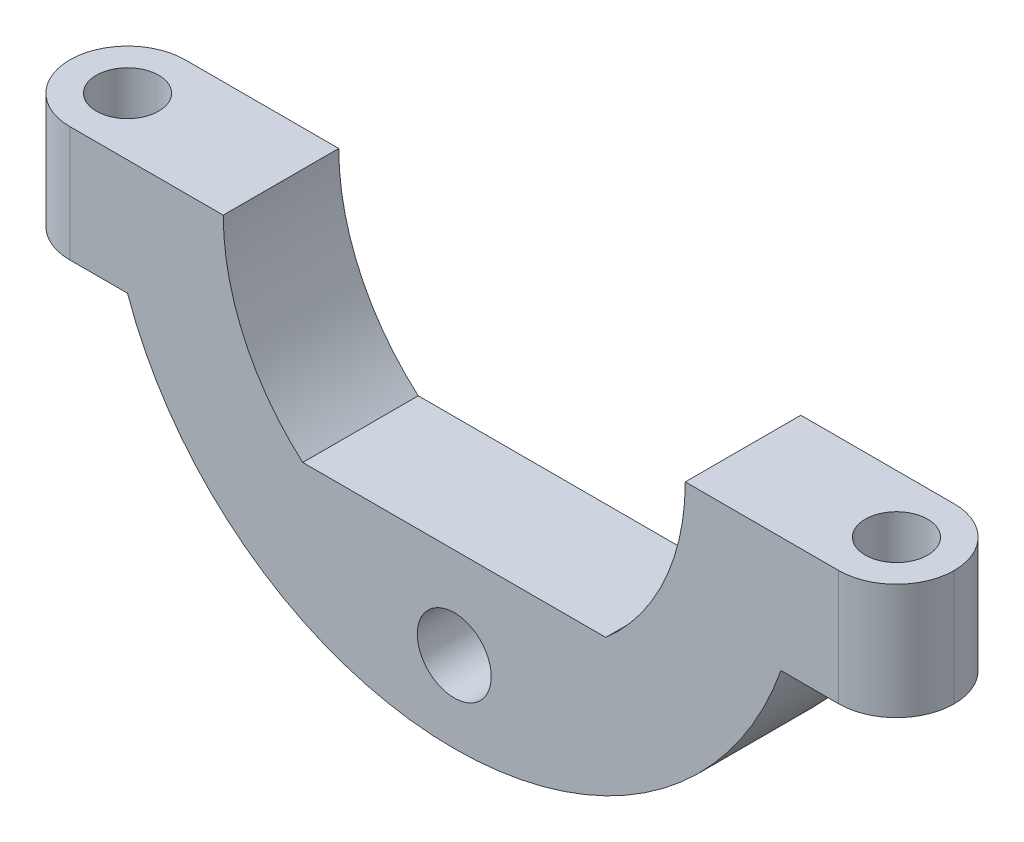
ISO-10303-21;
HEADER;
FILE_DESCRIPTION(('STEP AP214'),'2;1');
FILE_NAME('part.step','',(''),(''),'','','');
FILE_SCHEMA(('AUTOMOTIVE_DESIGN { 1 0 10303 214 1 1 1 1 }'));
ENDSEC;
DATA;
#1=APPLICATION_CONTEXT('core data for automotive mechanical design processes');
#2=APPLICATION_PROTOCOL_DEFINITION('international standard','automotive_design',2000,#1);
#3=PRODUCT_CONTEXT('',#1,'mechanical');
#4=PRODUCT('Part','Part','',(#3));
#5=PRODUCT_RELATED_PRODUCT_CATEGORY('part','',(#4));
#6=PRODUCT_DEFINITION_FORMATION('','',#4);
#7=PRODUCT_DEFINITION_CONTEXT('part definition',#1,'design');
#8=PRODUCT_DEFINITION('design','',#6,#7);
#9=PRODUCT_DEFINITION_SHAPE('','',#8);
#10=(LENGTH_UNIT() NAMED_UNIT(*) SI_UNIT(.MILLI.,.METRE.));
#11=(NAMED_UNIT(*) PLANE_ANGLE_UNIT() SI_UNIT($,.RADIAN.));
#12=(NAMED_UNIT(*) SI_UNIT($,.STERADIAN.) SOLID_ANGLE_UNIT());
#13=UNCERTAINTY_MEASURE_WITH_UNIT(LENGTH_MEASURE(1.E-05),#10,'distance_accuracy_value','');
#14=(GEOMETRIC_REPRESENTATION_CONTEXT(3) GLOBAL_UNCERTAINTY_ASSIGNED_CONTEXT((#13)) GLOBAL_UNIT_ASSIGNED_CONTEXT((#10,
#11,#12)) REPRESENTATION_CONTEXT('',''));
#15=CARTESIAN_POINT('',(0.,0.,0.));
#16=DIRECTION('',(0.,0.,1.));
#17=DIRECTION('',(1.,0.,0.));
#18=AXIS2_PLACEMENT_3D('',#15,#16,#17);
#19=CARTESIAN_POINT('',(0.,0.,0.));
#20=DIRECTION('',(0.,1.,0.));
#21=DIRECTION('',(0.,0.,1.));
#22=AXIS2_PLACEMENT_3D('',#19,#20,#21);
#23=PLANE('',#22);
#24=CARTESIAN_POINT('',(16.642135623731,0.,2.5));
#25=DIRECTION('',(0.,1.,0.));
#26=DIRECTION('',(0.,0.,1.));
#27=AXIS2_PLACEMENT_3D('',#24,#25,#26);
#28=CIRCLE('',#27,1.35000000000001);
#29=CARTESIAN_POINT('',(16.642135623731,0.,3.85000000000001));
#30=VERTEX_POINT('',#29);
#31=EDGE_CURVE('E162',#30,#30,#28,.F.);
#32=ORIENTED_EDGE('',*,*,#31,.T.);
#33=EDGE_LOOP('',(#32));
#34=FACE_BOUND('',#33,.T.);
#35=DIRECTION('',(0.,0.,-1.));
#36=VECTOR('',#35,1.);
#37=CARTESIAN_POINT('',(10.,0.,5.));
#38=LINE('',#37,#36);
#39=CARTESIAN_POINT('',(10.,0.,5.));
#40=VERTEX_POINT('',#39);
#41=CARTESIAN_POINT('',(10.,0.,0.));
#42=VERTEX_POINT('',#41);
#43=EDGE_CURVE('E150',#40,#42,#38,.T.);
#44=ORIENTED_EDGE('',*,*,#43,.F.);
#45=DIRECTION('',(-1.,0.,0.));
#46=VECTOR('',#45,1.);
#47=CARTESIAN_POINT('',(0.,0.,5.));
#48=LINE('',#47,#46);
#49=CARTESIAN_POINT('',(16.642135623731,0.,5.));
#50=VERTEX_POINT('',#49);
#51=EDGE_CURVE('E216',#50,#40,#48,.T.);
#52=ORIENTED_EDGE('',*,*,#51,.F.);
#53=CARTESIAN_POINT('',(16.642135623731,0.,2.5));
#54=DIRECTION('',(0.,1.,0.));
#55=DIRECTION('',(0.,0.,1.));
#56=AXIS2_PLACEMENT_3D('',#53,#54,#55);
#57=CIRCLE('',#56,2.5);
#58=CARTESIAN_POINT('',(19.142135623731,0.,2.5));
#59=VERTEX_POINT('',#58);
#60=EDGE_CURVE('E209',#59,#50,#57,.F.);
#61=ORIENTED_EDGE('',*,*,#60,.F.);
#62=CARTESIAN_POINT('',(16.642135623731,0.,2.5));
#63=DIRECTION('',(0.,1.,0.));
#64=DIRECTION('',(0.,0.,1.));
#65=AXIS2_PLACEMENT_3D('',#62,#63,#64);
#66=CIRCLE('',#65,2.5);
#67=CARTESIAN_POINT('',(16.642135623731,0.,0.));
#68=VERTEX_POINT('',#67);
#69=EDGE_CURVE('E158',#68,#59,#66,.F.);
#70=ORIENTED_EDGE('',*,*,#69,.F.);
#71=DIRECTION('',(-1.,0.,0.));
#72=VECTOR('',#71,1.);
#73=CARTESIAN_POINT('',(0.,0.,0.));
#74=LINE('',#73,#72);
#75=EDGE_CURVE('E143',#68,#42,#74,.T.);
#76=ORIENTED_EDGE('',*,*,#75,.T.);
#77=EDGE_LOOP('',(#44,#52,#61,#70,#76));
#78=FACE_BOUND('',#77,.T.);
#79=ADVANCED_FACE('F40',(#34,#78),#23,.T.);
#80=DIRECTION('',(0.,0.,-1.));
#81=VECTOR('',#80,1.);
#82=CARTESIAN_POINT('',(-10.,0.,5.));
#83=LINE('',#82,#81);
#84=CARTESIAN_POINT('',(-10.,0.,0.));
#85=VERTEX_POINT('',#84);
#86=CARTESIAN_POINT('',(-10.,0.,5.));
#87=VERTEX_POINT('',#86);
#88=EDGE_CURVE('E155',#85,#87,#83,.F.);
#89=ORIENTED_EDGE('',*,*,#88,.F.);
#90=CARTESIAN_POINT('',(-16.642135623731,0.,0.));
#91=VERTEX_POINT('',#90);
#92=EDGE_CURVE('E159',#85,#91,#74,.T.);
#93=ORIENTED_EDGE('',*,*,#92,.T.);
#94=CARTESIAN_POINT('',(-16.642135623731,0.,2.5));
#95=DIRECTION('',(0.,1.,0.));
#96=DIRECTION('',(0.,0.,1.));
#97=AXIS2_PLACEMENT_3D('',#94,#95,#96);
#98=CIRCLE('',#97,2.5);
#99=CARTESIAN_POINT('',(-19.142135623731,0.,2.5));
#100=VERTEX_POINT('',#99);
#101=EDGE_CURVE('E207',#100,#91,#98,.F.);
#102=ORIENTED_EDGE('',*,*,#101,.F.);
#103=CARTESIAN_POINT('',(-16.642135623731,0.,2.5));
#104=DIRECTION('',(0.,1.,0.));
#105=DIRECTION('',(0.,0.,1.));
#106=AXIS2_PLACEMENT_3D('',#103,#104,#105);
#107=CIRCLE('',#106,2.5);
#108=CARTESIAN_POINT('',(-16.642135623731,0.,5.));
#109=VERTEX_POINT('',#108);
#110=EDGE_CURVE('E204',#109,#100,#107,.F.);
#111=ORIENTED_EDGE('',*,*,#110,.F.);
#112=EDGE_CURVE('E215',#87,#109,#48,.T.);
#113=ORIENTED_EDGE('',*,*,#112,.F.);
#114=EDGE_LOOP('',(#89,#93,#102,#111,#113));
#115=FACE_BOUND('',#114,.T.);
#116=CARTESIAN_POINT('',(-16.642135623731,0.,2.5));
#117=DIRECTION('',(0.,1.,0.));
#118=DIRECTION('',(0.,0.,1.));
#119=AXIS2_PLACEMENT_3D('',#116,#117,#118);
#120=CIRCLE('',#119,1.35000000000001);
#121=CARTESIAN_POINT('',(-16.642135623731,0.,3.85000000000001));
#122=VERTEX_POINT('',#121);
#123=EDGE_CURVE('E212',#122,#122,#120,.T.);
#124=ORIENTED_EDGE('',*,*,#123,.F.);
#125=EDGE_LOOP('',(#124));
#126=FACE_BOUND('',#125,.T.);
#127=ADVANCED_FACE('F246',(#115,#126),#23,.T.);
#128=CARTESIAN_POINT('',(0.,0.,5.));
#129=DIRECTION('',(0.,0.,-1.));
#130=DIRECTION('',(-1.,0.,0.));
#131=AXIS2_PLACEMENT_3D('',#128,#129,#130);
#132=CYLINDRICAL_SURFACE('',#131,10.);
#133=CARTESIAN_POINT('',(0.,0.,5.));
#134=DIRECTION('',(0.,0.,1.));
#135=DIRECTION('',(1.,0.,0.));
#136=AXIS2_PLACEMENT_3D('',#133,#134,#135);
#137=CIRCLE('',#136,10.);
#138=CARTESIAN_POINT('',(6.55724789831832,-7.55,5.));
#139=VERTEX_POINT('',#138);
#140=EDGE_CURVE('E152',#139,#40,#137,.T.);
#141=ORIENTED_EDGE('',*,*,#140,.T.);
#142=ORIENTED_EDGE('',*,*,#43,.T.);
#143=CARTESIAN_POINT('',(0.,0.,0.));
#144=DIRECTION('',(0.,0.,1.));
#145=DIRECTION('',(1.,0.,0.));
#146=AXIS2_PLACEMENT_3D('',#143,#144,#145);
#147=CIRCLE('',#146,10.);
#148=CARTESIAN_POINT('',(6.55724789831832,-7.55,0.));
#149=VERTEX_POINT('',#148);
#150=EDGE_CURVE('E139',#149,#42,#147,.T.);
#151=ORIENTED_EDGE('',*,*,#150,.F.);
#152=DIRECTION('',(0.,0.,-1.));
#153=VECTOR('',#152,1.);
#154=CARTESIAN_POINT('',(6.55724789831832,-7.55,5.));
#155=LINE('',#154,#153);
#156=EDGE_CURVE('E57',#139,#149,#155,.T.);
#157=ORIENTED_EDGE('',*,*,#156,.F.);
#158=EDGE_LOOP('',(#141,#142,#151,#157));
#159=FACE_BOUND('',#158,.T.);
#160=ADVANCED_FACE('F151',(#159),#132,.F.);
#161=CARTESIAN_POINT('',(0.,-7.55,5.));
#162=DIRECTION('',(0.,1.,0.));
#163=DIRECTION('',(0.,0.,1.));
#164=AXIS2_PLACEMENT_3D('',#161,#162,#163);
#165=PLANE('',#164);
#166=DIRECTION('',(1.,0.,0.));
#167=VECTOR('',#166,1.);
#168=CARTESIAN_POINT('',(0.,-7.55,0.));
#169=LINE('',#168,#167);
#170=CARTESIAN_POINT('',(-6.55724789831832,-7.55,0.));
#171=VERTEX_POINT('',#170);
#172=EDGE_CURVE('E145',#171,#149,#169,.T.);
#173=ORIENTED_EDGE('',*,*,#172,.F.);
#174=DIRECTION('',(0.,0.,-1.));
#175=VECTOR('',#174,1.);
#176=CARTESIAN_POINT('',(-6.55724789831832,-7.55,5.));
#177=LINE('',#176,#175);
#178=CARTESIAN_POINT('',(-6.55724789831832,-7.55,5.));
#179=VERTEX_POINT('',#178);
#180=EDGE_CURVE('E302',#179,#171,#177,.T.);
#181=ORIENTED_EDGE('',*,*,#180,.F.);
#182=DIRECTION('',(1.,0.,0.));
#183=VECTOR('',#182,1.);
#184=CARTESIAN_POINT('',(0.,-7.55,5.));
#185=LINE('',#184,#183);
#186=EDGE_CURVE('E185',#179,#139,#185,.T.);
#187=ORIENTED_EDGE('',*,*,#186,.T.);
#188=ORIENTED_EDGE('',*,*,#156,.T.);
#189=EDGE_LOOP('',(#173,#181,#187,#188));
#190=FACE_BOUND('',#189,.T.);
#191=ADVANCED_FACE('F253',(#190),#165,.T.);
#192=EDGE_CURVE('E148',#85,#171,#147,.T.);
#193=ORIENTED_EDGE('',*,*,#192,.F.);
#194=ORIENTED_EDGE('',*,*,#88,.T.);
#195=EDGE_CURVE('E76',#87,#179,#137,.T.);
#196=ORIENTED_EDGE('',*,*,#195,.T.);
#197=ORIENTED_EDGE('',*,*,#180,.T.);
#198=EDGE_LOOP('',(#193,#194,#196,#197));
#199=FACE_BOUND('',#198,.T.);
#200=ADVANCED_FACE('F218',(#199),#132,.F.);
#201=CARTESIAN_POINT('',(0.,0.,5.));
#202=DIRECTION('',(0.,0.,-1.));
#203=DIRECTION('',(-1.,0.,0.));
#204=AXIS2_PLACEMENT_3D('',#201,#202,#203);
#205=CYLINDRICAL_SURFACE('',#204,15.);
#206=CARTESIAN_POINT('',(0.,0.,0.));
#207=DIRECTION('',(0.,0.,1.));
#208=DIRECTION('',(1.,0.,0.));
#209=AXIS2_PLACEMENT_3D('',#206,#207,#208);
#210=CIRCLE('',#209,15.);
#211=CARTESIAN_POINT('',(-14.142135623731,-5.,0.));
#212=VERTEX_POINT('',#211);
#213=CARTESIAN_POINT('',(14.1421356237309,-5.,0.));
#214=VERTEX_POINT('',#213);
#215=EDGE_CURVE('E186',#212,#214,#210,.T.);
#216=ORIENTED_EDGE('',*,*,#215,.T.);
#217=DIRECTION('',(0.,0.,-1.));
#218=VECTOR('',#217,1.);
#219=CARTESIAN_POINT('',(14.1421356237309,-5.,5.));
#220=LINE('',#219,#218);
#221=CARTESIAN_POINT('',(14.1421356237309,-5.,5.));
#222=VERTEX_POINT('',#221);
#223=EDGE_CURVE('E300',#222,#214,#220,.T.);
#224=ORIENTED_EDGE('',*,*,#223,.F.);
#225=CARTESIAN_POINT('',(0.,0.,5.));
#226=DIRECTION('',(0.,0.,1.));
#227=DIRECTION('',(1.,0.,0.));
#228=AXIS2_PLACEMENT_3D('',#225,#226,#227);
#229=CIRCLE('',#228,15.);
#230=CARTESIAN_POINT('',(-14.142135623731,-5.,5.));
#231=VERTEX_POINT('',#230);
#232=EDGE_CURVE('E179',#231,#222,#229,.T.);
#233=ORIENTED_EDGE('',*,*,#232,.F.);
#234=DIRECTION('',(0.,0.,-1.));
#235=VECTOR('',#234,1.);
#236=CARTESIAN_POINT('',(-14.142135623731,-5.,5.));
#237=LINE('',#236,#235);
#238=EDGE_CURVE('E87',#231,#212,#237,.T.);
#239=ORIENTED_EDGE('',*,*,#238,.T.);
#240=EDGE_LOOP('',(#216,#224,#233,#239));
#241=FACE_BOUND('',#240,.T.);
#242=ADVANCED_FACE('F260',(#241),#205,.T.);
#243=CARTESIAN_POINT('',(0.,-11.5,0.));
#244=DIRECTION('',(0.,0.,1.));
#245=DIRECTION('',(1.,0.,0.));
#246=AXIS2_PLACEMENT_3D('',#243,#244,#245);
#247=CYLINDRICAL_SURFACE('',#246,1.6);
#248=CARTESIAN_POINT('',(0.,-11.5,0.));
#249=DIRECTION('',(0.,0.,1.));
#250=DIRECTION('',(-1.,0.,0.));
#251=AXIS2_PLACEMENT_3D('',#248,#249,#250);
#252=CIRCLE('',#251,1.6);
#253=CARTESIAN_POINT('',(-1.6,-11.5,0.));
#254=VERTEX_POINT('',#253);
#255=EDGE_CURVE('E189',#254,#254,#252,.T.);
#256=ORIENTED_EDGE('',*,*,#255,.F.);
#257=EDGE_LOOP('',(#256));
#258=FACE_BOUND('',#257,.T.);
#259=CARTESIAN_POINT('',(0.,-11.5,5.));
#260=DIRECTION('',(0.,0.,1.));
#261=DIRECTION('',(-1.,0.,0.));
#262=AXIS2_PLACEMENT_3D('',#259,#260,#261);
#263=CIRCLE('',#262,1.6);
#264=CARTESIAN_POINT('',(-1.6,-11.5,5.));
#265=VERTEX_POINT('',#264);
#266=EDGE_CURVE('E194',#265,#265,#263,.T.);
#267=ORIENTED_EDGE('',*,*,#266,.T.);
#268=EDGE_LOOP('',(#267));
#269=FACE_BOUND('',#268,.T.);
#270=ADVANCED_FACE('F258',(#258,#269),#247,.F.);
#271=CARTESIAN_POINT('',(0.,-5.,5.));
#272=DIRECTION('',(0.,1.,0.));
#273=DIRECTION('',(0.,0.,1.));
#274=AXIS2_PLACEMENT_3D('',#271,#272,#273);
#275=PLANE('',#274);
#276=CARTESIAN_POINT('',(16.642135623731,-5.,2.5));
#277=DIRECTION('',(0.,-1.,0.));
#278=DIRECTION('',(1.,0.,0.));
#279=AXIS2_PLACEMENT_3D('',#276,#277,#278);
#280=CIRCLE('',#279,1.35000000000001);
#281=CARTESIAN_POINT('',(17.992135623731,-5.,2.5));
#282=VERTEX_POINT('',#281);
#283=EDGE_CURVE('E146',#282,#282,#280,.T.);
#284=ORIENTED_EDGE('',*,*,#283,.F.);
#285=EDGE_LOOP('',(#284));
#286=FACE_BOUND('',#285,.T.);
#287=CARTESIAN_POINT('',(16.642135623731,-5.,2.5));
#288=DIRECTION('',(0.,1.,0.));
#289=DIRECTION('',(0.,0.,1.));
#290=AXIS2_PLACEMENT_3D('',#287,#288,#289);
#291=CIRCLE('',#290,2.5);
#292=CARTESIAN_POINT('',(16.642135623731,-5.,0.));
#293=VERTEX_POINT('',#292);
#294=CARTESIAN_POINT('',(19.142135623731,-5.,2.5));
#295=VERTEX_POINT('',#294);
#296=EDGE_CURVE('E298',#293,#295,#291,.F.);
#297=ORIENTED_EDGE('',*,*,#296,.T.);
#298=CARTESIAN_POINT('',(16.642135623731,-5.,2.5));
#299=DIRECTION('',(0.,1.,0.));
#300=DIRECTION('',(0.,0.,1.));
#301=AXIS2_PLACEMENT_3D('',#298,#299,#300);
#302=CIRCLE('',#301,2.5);
#303=CARTESIAN_POINT('',(16.642135623731,-5.,5.));
#304=VERTEX_POINT('',#303);
#305=EDGE_CURVE('E178',#295,#304,#302,.F.);
#306=ORIENTED_EDGE('',*,*,#305,.T.);
#307=DIRECTION('',(1.,0.,0.));
#308=VECTOR('',#307,1.);
#309=CARTESIAN_POINT('',(0.,-5.,5.));
#310=LINE('',#309,#308);
#311=EDGE_CURVE('E182',#222,#304,#310,.T.);
#312=ORIENTED_EDGE('',*,*,#311,.F.);
#313=ORIENTED_EDGE('',*,*,#223,.T.);
#314=DIRECTION('',(1.,0.,0.));
#315=VECTOR('',#314,1.);
#316=CARTESIAN_POINT('',(0.,-5.,0.));
#317=LINE('',#316,#315);
#318=EDGE_CURVE('E187',#214,#293,#317,.T.);
#319=ORIENTED_EDGE('',*,*,#318,.T.);
#320=EDGE_LOOP('',(#297,#306,#312,#313,#319));
#321=FACE_BOUND('',#320,.T.);
#322=ADVANCED_FACE('F269',(#286,#321),#275,.F.);
#323=CARTESIAN_POINT('',(0.,0.,0.));
#324=DIRECTION('',(0.,0.,1.));
#325=DIRECTION('',(1.,0.,0.));
#326=AXIS2_PLACEMENT_3D('',#323,#324,#325);
#327=PLANE('',#326);
#328=ORIENTED_EDGE('',*,*,#255,.T.);
#329=EDGE_LOOP('',(#328));
#330=FACE_BOUND('',#329,.T.);
#331=ORIENTED_EDGE('',*,*,#75,.F.);
#332=DIRECTION('',(0.,-1.,0.));
#333=VECTOR('',#332,1.);
#334=CARTESIAN_POINT('',(16.642135623731,-5.,0.));
#335=LINE('',#334,#333);
#336=EDGE_CURVE('E167',#68,#293,#335,.T.);
#337=ORIENTED_EDGE('',*,*,#336,.T.);
#338=ORIENTED_EDGE('',*,*,#318,.F.);
#339=ORIENTED_EDGE('',*,*,#215,.F.);
#340=DIRECTION('',(-1.,0.,0.));
#341=VECTOR('',#340,1.);
#342=CARTESIAN_POINT('',(0.,-5.,0.));
#343=LINE('',#342,#341);
#344=CARTESIAN_POINT('',(-16.642135623731,-5.,0.));
#345=VERTEX_POINT('',#344);
#346=EDGE_CURVE('E184',#212,#345,#343,.T.);
#347=ORIENTED_EDGE('',*,*,#346,.T.);
#348=DIRECTION('',(0.,-1.,0.));
#349=VECTOR('',#348,1.);
#350=CARTESIAN_POINT('',(-16.642135623731,0.,0.));
#351=LINE('',#350,#349);
#352=EDGE_CURVE('E169',#345,#91,#351,.F.);
#353=ORIENTED_EDGE('',*,*,#352,.T.);
#354=ORIENTED_EDGE('',*,*,#92,.F.);
#355=ORIENTED_EDGE('',*,*,#192,.T.);
#356=ORIENTED_EDGE('',*,*,#172,.T.);
#357=ORIENTED_EDGE('',*,*,#150,.T.);
#358=EDGE_LOOP('',(#331,#337,#338,#339,#347,#353,#354,#355,#356,#357));
#359=FACE_BOUND('',#358,.T.);
#360=ADVANCED_FACE('F141',(#330,#359),#327,.F.);
#361=CARTESIAN_POINT('',(0.,-5.,5.));
#362=DIRECTION('',(0.,-1.,0.));
#363=DIRECTION('',(0.,0.,-1.));
#364=AXIS2_PLACEMENT_3D('',#361,#362,#363);
#365=PLANE('',#364);
#366=CARTESIAN_POINT('',(-16.642135623731,-5.,2.5));
#367=DIRECTION('',(0.,1.,0.));
#368=DIRECTION('',(-1.,0.,0.));
#369=AXIS2_PLACEMENT_3D('',#366,#367,#368);
#370=CIRCLE('',#369,1.35000000000001);
#371=CARTESIAN_POINT('',(-17.992135623731,-5.,2.5));
#372=VERTEX_POINT('',#371);
#373=EDGE_CURVE('E199',#372,#372,#370,.T.);
#374=ORIENTED_EDGE('',*,*,#373,.T.);
#375=EDGE_LOOP('',(#374));
#376=FACE_BOUND('',#375,.T.);
#377=DIRECTION('',(-1.,0.,0.));
#378=VECTOR('',#377,1.);
#379=CARTESIAN_POINT('',(0.,-5.,5.));
#380=LINE('',#379,#378);
#381=CARTESIAN_POINT('',(-16.642135623731,-5.,5.));
#382=VERTEX_POINT('',#381);
#383=EDGE_CURVE('E293',#231,#382,#380,.T.);
#384=ORIENTED_EDGE('',*,*,#383,.T.);
#385=CARTESIAN_POINT('',(-16.642135623731,-5.,2.5));
#386=DIRECTION('',(0.,-1.,0.));
#387=DIRECTION('',(0.,0.,-1.));
#388=AXIS2_PLACEMENT_3D('',#385,#386,#387);
#389=CIRCLE('',#388,2.5);
#390=CARTESIAN_POINT('',(-19.142135623731,-5.,2.5));
#391=VERTEX_POINT('',#390);
#392=EDGE_CURVE('E206',#382,#391,#389,.T.);
#393=ORIENTED_EDGE('',*,*,#392,.T.);
#394=CARTESIAN_POINT('',(-16.642135623731,-5.,2.5));
#395=DIRECTION('',(0.,-1.,0.));
#396=DIRECTION('',(0.,0.,-1.));
#397=AXIS2_PLACEMENT_3D('',#394,#395,#396);
#398=CIRCLE('',#397,2.5);
#399=EDGE_CURVE('E170',#391,#345,#398,.T.);
#400=ORIENTED_EDGE('',*,*,#399,.T.);
#401=ORIENTED_EDGE('',*,*,#346,.F.);
#402=ORIENTED_EDGE('',*,*,#238,.F.);
#403=EDGE_LOOP('',(#384,#393,#400,#401,#402));
#404=FACE_BOUND('',#403,.T.);
#405=ADVANCED_FACE('F235',(#376,#404),#365,.T.);
#406=CARTESIAN_POINT('',(-16.642135623731,0.,2.5));
#407=DIRECTION('',(0.,-1.,0.));
#408=DIRECTION('',(0.,0.,-1.));
#409=AXIS2_PLACEMENT_3D('',#406,#407,#408);
#410=CYLINDRICAL_SURFACE('',#409,2.5);
#411=DIRECTION('',(0.,-1.,0.));
#412=VECTOR('',#411,1.);
#413=CARTESIAN_POINT('',(-19.142135623731,0.,2.5));
#414=LINE('',#413,#412);
#415=EDGE_CURVE('E11',#100,#391,#414,.T.);
#416=ORIENTED_EDGE('',*,*,#415,.F.);
#417=ORIENTED_EDGE('',*,*,#101,.T.);
#418=ORIENTED_EDGE('',*,*,#352,.F.);
#419=ORIENTED_EDGE('',*,*,#399,.F.);
#420=EDGE_LOOP('',(#416,#417,#418,#419));
#421=FACE_BOUND('',#420,.T.);
#422=ADVANCED_FACE('F265',(#421),#410,.T.);
#423=CARTESIAN_POINT('',(0.,0.,5.));
#424=DIRECTION('',(0.,0.,1.));
#425=DIRECTION('',(1.,0.,0.));
#426=AXIS2_PLACEMENT_3D('',#423,#424,#425);
#427=PLANE('',#426);
#428=ORIENTED_EDGE('',*,*,#266,.F.);
#429=EDGE_LOOP('',(#428));
#430=FACE_BOUND('',#429,.T.);
#431=DIRECTION('',(0.,-1.,0.));
#432=VECTOR('',#431,1.);
#433=CARTESIAN_POINT('',(16.642135623731,0.,5.));
#434=LINE('',#433,#432);
#435=EDGE_CURVE('E173',#304,#50,#434,.F.);
#436=ORIENTED_EDGE('',*,*,#435,.T.);
#437=ORIENTED_EDGE('',*,*,#51,.T.);
#438=ORIENTED_EDGE('',*,*,#140,.F.);
#439=ORIENTED_EDGE('',*,*,#186,.F.);
#440=ORIENTED_EDGE('',*,*,#195,.F.);
#441=ORIENTED_EDGE('',*,*,#112,.T.);
#442=DIRECTION('',(0.,-1.,0.));
#443=VECTOR('',#442,1.);
#444=CARTESIAN_POINT('',(-16.642135623731,-5.,5.));
#445=LINE('',#444,#443);
#446=EDGE_CURVE('E176',#109,#382,#445,.T.);
#447=ORIENTED_EDGE('',*,*,#446,.T.);
#448=ORIENTED_EDGE('',*,*,#383,.F.);
#449=ORIENTED_EDGE('',*,*,#232,.T.);
#450=ORIENTED_EDGE('',*,*,#311,.T.);
#451=EDGE_LOOP('',(#436,#437,#438,#439,#440,#441,#447,#448,#449,#450));
#452=FACE_BOUND('',#451,.T.);
#453=ADVANCED_FACE('F224',(#430,#452),#427,.T.);
#454=CARTESIAN_POINT('',(-16.642135623731,0.,2.5));
#455=DIRECTION('',(0.,1.,0.));
#456=DIRECTION('',(0.,0.,1.));
#457=AXIS2_PLACEMENT_3D('',#454,#455,#456);
#458=CYLINDRICAL_SURFACE('',#457,2.5);
#459=ORIENTED_EDGE('',*,*,#446,.F.);
#460=ORIENTED_EDGE('',*,*,#110,.T.);
#461=ORIENTED_EDGE('',*,*,#415,.T.);
#462=ORIENTED_EDGE('',*,*,#392,.F.);
#463=EDGE_LOOP('',(#459,#460,#461,#462));
#464=FACE_BOUND('',#463,.T.);
#465=ADVANCED_FACE('F42',(#464),#458,.T.);
#466=CARTESIAN_POINT('',(16.642135623731,0.,2.5));
#467=DIRECTION('',(0.,1.,0.));
#468=DIRECTION('',(0.,0.,1.));
#469=AXIS2_PLACEMENT_3D('',#466,#467,#468);
#470=CYLINDRICAL_SURFACE('',#469,2.5);
#471=ORIENTED_EDGE('',*,*,#336,.F.);
#472=ORIENTED_EDGE('',*,*,#69,.T.);
#473=DIRECTION('',(0.,-1.,0.));
#474=VECTOR('',#473,1.);
#475=CARTESIAN_POINT('',(19.142135623731,5.,2.5));
#476=LINE('',#475,#474);
#477=EDGE_CURVE('E49',#295,#59,#476,.F.);
#478=ORIENTED_EDGE('',*,*,#477,.F.);
#479=ORIENTED_EDGE('',*,*,#296,.F.);
#480=EDGE_LOOP('',(#471,#472,#478,#479));
#481=FACE_BOUND('',#480,.T.);
#482=ADVANCED_FACE('F272',(#481),#470,.T.);
#483=CARTESIAN_POINT('',(16.642135623731,0.,2.5));
#484=DIRECTION('',(0.,-1.,0.));
#485=DIRECTION('',(0.,0.,-1.));
#486=AXIS2_PLACEMENT_3D('',#483,#484,#485);
#487=CYLINDRICAL_SURFACE('',#486,2.5);
#488=ORIENTED_EDGE('',*,*,#477,.T.);
#489=ORIENTED_EDGE('',*,*,#60,.T.);
#490=ORIENTED_EDGE('',*,*,#435,.F.);
#491=ORIENTED_EDGE('',*,*,#305,.F.);
#492=EDGE_LOOP('',(#488,#489,#490,#491));
#493=FACE_BOUND('',#492,.T.);
#494=ADVANCED_FACE('F242',(#493),#487,.T.);
#495=CARTESIAN_POINT('',(-16.6421356237309,15.,2.5));
#496=DIRECTION('',(0.,-1.,0.));
#497=DIRECTION('',(1.,0.,0.));
#498=AXIS2_PLACEMENT_3D('',#495,#496,#497);
#499=CYLINDRICAL_SURFACE('',#498,1.35000000000001);
#500=ORIENTED_EDGE('',*,*,#373,.F.);
#501=EDGE_LOOP('',(#500));
#502=FACE_BOUND('',#501,.T.);
#503=ORIENTED_EDGE('',*,*,#123,.T.);
#504=EDGE_LOOP('',(#503));
#505=FACE_BOUND('',#504,.T.);
#506=ADVANCED_FACE('F238',(#502,#505),#499,.F.);
#507=CARTESIAN_POINT('',(16.6421356237309,15.,2.5));
#508=DIRECTION('',(0.,-1.,0.));
#509=DIRECTION('',(1.,0.,0.));
#510=AXIS2_PLACEMENT_3D('',#507,#508,#509);
#511=CYLINDRICAL_SURFACE('',#510,1.35000000000001);
#512=ORIENTED_EDGE('',*,*,#283,.T.);
#513=EDGE_LOOP('',(#512));
#514=FACE_BOUND('',#513,.T.);
#515=ORIENTED_EDGE('',*,*,#31,.F.);
#516=EDGE_LOOP('',(#515));
#517=FACE_BOUND('',#516,.T.);
#518=ADVANCED_FACE('F241',(#514,#517),#511,.F.);
#519=CLOSED_SHELL('',(#79,#127,#160,#191,#200,#242,#270,#322,#360,#405,#422,#453,#465,#482,#494,
#506,#518));
#520=MANIFOLD_SOLID_BREP('B2',#519);
#521=ADVANCED_BREP_SHAPE_REPRESENTATION('',(#18,#520),#14);
#522=SHAPE_DEFINITION_REPRESENTATION(#9,#521);
ENDSEC;
END-ISO-10303-21;
